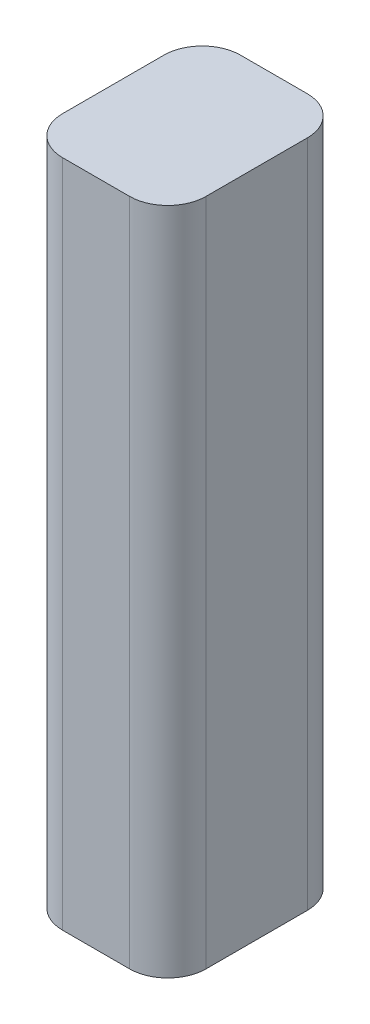
ISO-10303-21;
HEADER;
FILE_DESCRIPTION(('STEP AP214'),'2;1');
FILE_NAME('part.step','',(''),(''),'','','');
FILE_SCHEMA(('AUTOMOTIVE_DESIGN { 1 0 10303 214 1 1 1 1 }'));
ENDSEC;
DATA;
#1=APPLICATION_CONTEXT('core data for automotive mechanical design processes');
#2=APPLICATION_PROTOCOL_DEFINITION('international standard','automotive_design',2000,#1);
#3=PRODUCT_CONTEXT('',#1,'mechanical');
#4=PRODUCT('Part','Part','',(#3));
#5=PRODUCT_RELATED_PRODUCT_CATEGORY('part','',(#4));
#6=PRODUCT_DEFINITION_FORMATION('','',#4);
#7=PRODUCT_DEFINITION_CONTEXT('part definition',#1,'design');
#8=PRODUCT_DEFINITION('design','',#6,#7);
#9=PRODUCT_DEFINITION_SHAPE('','',#8);
#10=(LENGTH_UNIT() NAMED_UNIT(*) SI_UNIT(.MILLI.,.METRE.));
#11=(NAMED_UNIT(*) PLANE_ANGLE_UNIT() SI_UNIT($,.RADIAN.));
#12=(NAMED_UNIT(*) SI_UNIT($,.STERADIAN.) SOLID_ANGLE_UNIT());
#13=UNCERTAINTY_MEASURE_WITH_UNIT(LENGTH_MEASURE(1.E-05),#10,'distance_accuracy_value','');
#14=(GEOMETRIC_REPRESENTATION_CONTEXT(3) GLOBAL_UNCERTAINTY_ASSIGNED_CONTEXT((#13)) GLOBAL_UNIT_ASSIGNED_CONTEXT((#10,
#11,#12)) REPRESENTATION_CONTEXT('',''));
#15=CARTESIAN_POINT('',(0.,0.,0.));
#16=DIRECTION('',(0.,0.,1.));
#17=DIRECTION('',(1.,0.,0.));
#18=AXIS2_PLACEMENT_3D('',#15,#16,#17);
#19=CARTESIAN_POINT('',(-1.75,17.5,2.65));
#20=DIRECTION('',(0.,-1.,0.));
#21=DIRECTION('',(0.,0.,-1.));
#22=AXIS2_PLACEMENT_3D('',#19,#20,#21);
#23=CYLINDRICAL_SURFACE('',#22,2.);
#24=CARTESIAN_POINT('',(-1.75,-17.5,2.65));
#25=DIRECTION('',(0.,1.,0.));
#26=DIRECTION('',(0.,0.,-1.));
#27=AXIS2_PLACEMENT_3D('',#24,#25,#26);
#28=CIRCLE('',#27,2.);
#29=CARTESIAN_POINT('',(-3.75,-17.5,2.65));
#30=VERTEX_POINT('',#29);
#31=CARTESIAN_POINT('',(-1.75,-17.5,4.65));
#32=VERTEX_POINT('',#31);
#33=EDGE_CURVE('E146',#30,#32,#28,.T.);
#34=ORIENTED_EDGE('',*,*,#33,.T.);
#35=DIRECTION('',(0.,-1.,0.));
#36=VECTOR('',#35,1.);
#37=CARTESIAN_POINT('',(-1.75,17.5,4.65));
#38=LINE('',#37,#36);
#39=CARTESIAN_POINT('',(-1.75,17.5,4.65));
#40=VERTEX_POINT('',#39);
#41=EDGE_CURVE('E11',#40,#32,#38,.T.);
#42=ORIENTED_EDGE('',*,*,#41,.F.);
#43=CARTESIAN_POINT('',(-1.75,17.5,2.65));
#44=DIRECTION('',(0.,1.,0.));
#45=DIRECTION('',(0.,0.,-1.));
#46=AXIS2_PLACEMENT_3D('',#43,#44,#45);
#47=CIRCLE('',#46,2.);
#48=CARTESIAN_POINT('',(-3.75,17.5,2.65));
#49=VERTEX_POINT('',#48);
#50=EDGE_CURVE('E168',#49,#40,#47,.T.);
#51=ORIENTED_EDGE('',*,*,#50,.F.);
#52=DIRECTION('',(0.,-1.,0.));
#53=VECTOR('',#52,1.);
#54=CARTESIAN_POINT('',(-3.75,17.5,2.65));
#55=LINE('',#54,#53);
#56=EDGE_CURVE('E142',#49,#30,#55,.T.);
#57=ORIENTED_EDGE('',*,*,#56,.T.);
#58=EDGE_LOOP('',(#34,#42,#51,#57));
#59=FACE_BOUND('',#58,.T.);
#60=ADVANCED_FACE('F45',(#59),#23,.T.);
#61=CARTESIAN_POINT('',(1.75,17.5,4.65));
#62=DIRECTION('',(0.,0.,-1.));
#63=DIRECTION('',(-1.,0.,0.));
#64=AXIS2_PLACEMENT_3D('',#61,#62,#63);
#65=PLANE('',#64);
#66=DIRECTION('',(1.,0.,0.));
#67=VECTOR('',#66,1.);
#68=CARTESIAN_POINT('',(1.75,-17.5,4.65));
#69=LINE('',#68,#67);
#70=CARTESIAN_POINT('',(1.75,-17.5,4.65));
#71=VERTEX_POINT('',#70);
#72=EDGE_CURVE('E150',#32,#71,#69,.T.);
#73=ORIENTED_EDGE('',*,*,#72,.T.);
#74=DIRECTION('',(0.,-1.,0.));
#75=VECTOR('',#74,1.);
#76=CARTESIAN_POINT('',(1.75,17.5,4.65));
#77=LINE('',#76,#75);
#78=CARTESIAN_POINT('',(1.75,17.5,4.65));
#79=VERTEX_POINT('',#78);
#80=EDGE_CURVE('E54',#79,#71,#77,.T.);
#81=ORIENTED_EDGE('',*,*,#80,.F.);
#82=DIRECTION('',(1.,0.,0.));
#83=VECTOR('',#82,1.);
#84=CARTESIAN_POINT('',(1.75,17.5,4.65));
#85=LINE('',#84,#83);
#86=EDGE_CURVE('E105',#40,#79,#85,.T.);
#87=ORIENTED_EDGE('',*,*,#86,.F.);
#88=ORIENTED_EDGE('',*,*,#41,.T.);
#89=EDGE_LOOP('',(#73,#81,#87,#88));
#90=FACE_BOUND('',#89,.T.);
#91=ADVANCED_FACE('F214',(#90),#65,.F.);
#92=CARTESIAN_POINT('',(1.75,17.5,2.65));
#93=DIRECTION('',(0.,-1.,0.));
#94=DIRECTION('',(0.,0.,-1.));
#95=AXIS2_PLACEMENT_3D('',#92,#93,#94);
#96=CYLINDRICAL_SURFACE('',#95,2.);
#97=CARTESIAN_POINT('',(1.75,-17.5,2.65));
#98=DIRECTION('',(0.,1.,0.));
#99=DIRECTION('',(0.,0.,-1.));
#100=AXIS2_PLACEMENT_3D('',#97,#98,#99);
#101=CIRCLE('',#100,2.);
#102=CARTESIAN_POINT('',(3.75,-17.5,2.65));
#103=VERTEX_POINT('',#102);
#104=EDGE_CURVE('E153',#71,#103,#101,.T.);
#105=ORIENTED_EDGE('',*,*,#104,.T.);
#106=DIRECTION('',(0.,-1.,0.));
#107=VECTOR('',#106,1.);
#108=CARTESIAN_POINT('',(3.75,17.5,2.65));
#109=LINE('',#108,#107);
#110=CARTESIAN_POINT('',(3.75,17.5,2.65));
#111=VERTEX_POINT('',#110);
#112=EDGE_CURVE('E179',#111,#103,#109,.T.);
#113=ORIENTED_EDGE('',*,*,#112,.F.);
#114=CARTESIAN_POINT('',(1.75,17.5,2.65));
#115=DIRECTION('',(0.,1.,0.));
#116=DIRECTION('',(0.,0.,-1.));
#117=AXIS2_PLACEMENT_3D('',#114,#115,#116);
#118=CIRCLE('',#117,2.);
#119=EDGE_CURVE('E189',#79,#111,#118,.T.);
#120=ORIENTED_EDGE('',*,*,#119,.F.);
#121=ORIENTED_EDGE('',*,*,#80,.T.);
#122=EDGE_LOOP('',(#105,#113,#120,#121));
#123=FACE_BOUND('',#122,.T.);
#124=ADVANCED_FACE('F187',(#123),#96,.T.);
#125=CARTESIAN_POINT('',(3.75,17.5,-2.65));
#126=DIRECTION('',(-1.,0.,0.));
#127=DIRECTION('',(0.,0.,1.));
#128=AXIS2_PLACEMENT_3D('',#125,#126,#127);
#129=PLANE('',#128);
#130=DIRECTION('',(0.,0.,-1.));
#131=VECTOR('',#130,1.);
#132=CARTESIAN_POINT('',(3.75,-17.5,-2.65));
#133=LINE('',#132,#131);
#134=CARTESIAN_POINT('',(3.75,-17.5,-2.65));
#135=VERTEX_POINT('',#134);
#136=EDGE_CURVE('E156',#103,#135,#133,.T.);
#137=ORIENTED_EDGE('',*,*,#136,.T.);
#138=DIRECTION('',(0.,-1.,0.));
#139=VECTOR('',#138,1.);
#140=CARTESIAN_POINT('',(3.75,17.5,-2.65));
#141=LINE('',#140,#139);
#142=CARTESIAN_POINT('',(3.75,17.5,-2.65));
#143=VERTEX_POINT('',#142);
#144=EDGE_CURVE('E175',#143,#135,#141,.T.);
#145=ORIENTED_EDGE('',*,*,#144,.F.);
#146=DIRECTION('',(0.,0.,-1.));
#147=VECTOR('',#146,1.);
#148=CARTESIAN_POINT('',(3.75,17.5,-2.65));
#149=LINE('',#148,#147);
#150=EDGE_CURVE('E202',#111,#143,#149,.T.);
#151=ORIENTED_EDGE('',*,*,#150,.F.);
#152=ORIENTED_EDGE('',*,*,#112,.T.);
#153=EDGE_LOOP('',(#137,#145,#151,#152));
#154=FACE_BOUND('',#153,.T.);
#155=ADVANCED_FACE('F197',(#154),#129,.F.);
#156=CARTESIAN_POINT('',(1.75,17.5,-2.65));
#157=DIRECTION('',(0.,-1.,0.));
#158=DIRECTION('',(0.,0.,-1.));
#159=AXIS2_PLACEMENT_3D('',#156,#157,#158);
#160=CYLINDRICAL_SURFACE('',#159,2.);
#161=CARTESIAN_POINT('',(1.75,-17.5,-2.65));
#162=DIRECTION('',(0.,1.,0.));
#163=DIRECTION('',(0.,0.,-1.));
#164=AXIS2_PLACEMENT_3D('',#161,#162,#163);
#165=CIRCLE('',#164,2.);
#166=CARTESIAN_POINT('',(1.75,-17.5,-4.65));
#167=VERTEX_POINT('',#166);
#168=EDGE_CURVE('E159',#135,#167,#165,.T.);
#169=ORIENTED_EDGE('',*,*,#168,.T.);
#170=DIRECTION('',(0.,-1.,0.));
#171=VECTOR('',#170,1.);
#172=CARTESIAN_POINT('',(1.75,17.5,-4.65));
#173=LINE('',#172,#171);
#174=CARTESIAN_POINT('',(1.75,17.5,-4.65));
#175=VERTEX_POINT('',#174);
#176=EDGE_CURVE('E135',#175,#167,#173,.T.);
#177=ORIENTED_EDGE('',*,*,#176,.F.);
#178=CARTESIAN_POINT('',(1.75,17.5,-2.65));
#179=DIRECTION('',(0.,1.,0.));
#180=DIRECTION('',(0.,0.,-1.));
#181=AXIS2_PLACEMENT_3D('',#178,#179,#180);
#182=CIRCLE('',#181,2.);
#183=EDGE_CURVE('E124',#143,#175,#182,.T.);
#184=ORIENTED_EDGE('',*,*,#183,.F.);
#185=ORIENTED_EDGE('',*,*,#144,.T.);
#186=EDGE_LOOP('',(#169,#177,#184,#185));
#187=FACE_BOUND('',#186,.T.);
#188=ADVANCED_FACE('F200',(#187),#160,.T.);
#189=CARTESIAN_POINT('',(-1.75,17.5,-4.65));
#190=DIRECTION('',(0.,0.,1.));
#191=DIRECTION('',(1.,0.,0.));
#192=AXIS2_PLACEMENT_3D('',#189,#190,#191);
#193=PLANE('',#192);
#194=DIRECTION('',(-1.,0.,0.));
#195=VECTOR('',#194,1.);
#196=CARTESIAN_POINT('',(-1.75,-17.5,-4.65));
#197=LINE('',#196,#195);
#198=CARTESIAN_POINT('',(-1.75,-17.5,-4.65));
#199=VERTEX_POINT('',#198);
#200=EDGE_CURVE('E133',#167,#199,#197,.T.);
#201=ORIENTED_EDGE('',*,*,#200,.T.);
#202=DIRECTION('',(0.,-1.,0.));
#203=VECTOR('',#202,1.);
#204=CARTESIAN_POINT('',(-1.75,17.5,-4.65));
#205=LINE('',#204,#203);
#206=CARTESIAN_POINT('',(-1.75,17.5,-4.65));
#207=VERTEX_POINT('',#206);
#208=EDGE_CURVE('E130',#207,#199,#205,.T.);
#209=ORIENTED_EDGE('',*,*,#208,.F.);
#210=DIRECTION('',(-1.,0.,0.));
#211=VECTOR('',#210,1.);
#212=CARTESIAN_POINT('',(-1.75,17.5,-4.65));
#213=LINE('',#212,#211);
#214=EDGE_CURVE('E118',#175,#207,#213,.T.);
#215=ORIENTED_EDGE('',*,*,#214,.F.);
#216=ORIENTED_EDGE('',*,*,#176,.T.);
#217=EDGE_LOOP('',(#201,#209,#215,#216));
#218=FACE_BOUND('',#217,.T.);
#219=ADVANCED_FACE('F131',(#218),#193,.F.);
#220=CARTESIAN_POINT('',(-1.75,17.5,-2.65));
#221=DIRECTION('',(0.,-1.,0.));
#222=DIRECTION('',(0.,0.,-1.));
#223=AXIS2_PLACEMENT_3D('',#220,#221,#222);
#224=CYLINDRICAL_SURFACE('',#223,2.);
#225=CARTESIAN_POINT('',(-1.75,-17.5,-2.65));
#226=DIRECTION('',(0.,1.,0.));
#227=DIRECTION('',(0.,0.,-1.));
#228=AXIS2_PLACEMENT_3D('',#225,#226,#227);
#229=CIRCLE('',#228,2.);
#230=CARTESIAN_POINT('',(-3.75,-17.5,-2.65));
#231=VERTEX_POINT('',#230);
#232=EDGE_CURVE('E91',#199,#231,#229,.T.);
#233=ORIENTED_EDGE('',*,*,#232,.T.);
#234=DIRECTION('',(0.,-1.,0.));
#235=VECTOR('',#234,1.);
#236=CARTESIAN_POINT('',(-3.75,17.5,-2.65));
#237=LINE('',#236,#235);
#238=CARTESIAN_POINT('',(-3.75,17.5,-2.65));
#239=VERTEX_POINT('',#238);
#240=EDGE_CURVE('E136',#239,#231,#237,.T.);
#241=ORIENTED_EDGE('',*,*,#240,.F.);
#242=CARTESIAN_POINT('',(-1.75,17.5,-2.65));
#243=DIRECTION('',(0.,1.,0.));
#244=DIRECTION('',(0.,0.,-1.));
#245=AXIS2_PLACEMENT_3D('',#242,#243,#244);
#246=CIRCLE('',#245,2.);
#247=EDGE_CURVE('E122',#207,#239,#246,.T.);
#248=ORIENTED_EDGE('',*,*,#247,.F.);
#249=ORIENTED_EDGE('',*,*,#208,.T.);
#250=EDGE_LOOP('',(#233,#241,#248,#249));
#251=FACE_BOUND('',#250,.T.);
#252=ADVANCED_FACE('F138',(#251),#224,.T.);
#253=CARTESIAN_POINT('',(-3.75,17.5,2.65));
#254=DIRECTION('',(1.,0.,0.));
#255=DIRECTION('',(0.,0.,-1.));
#256=AXIS2_PLACEMENT_3D('',#253,#254,#255);
#257=PLANE('',#256);
#258=DIRECTION('',(0.,0.,1.));
#259=VECTOR('',#258,1.);
#260=CARTESIAN_POINT('',(-3.75,-17.5,2.65));
#261=LINE('',#260,#259);
#262=EDGE_CURVE('E97',#231,#30,#261,.T.);
#263=ORIENTED_EDGE('',*,*,#262,.T.);
#264=ORIENTED_EDGE('',*,*,#56,.F.);
#265=DIRECTION('',(0.,0.,1.));
#266=VECTOR('',#265,1.);
#267=CARTESIAN_POINT('',(-3.75,17.5,2.65));
#268=LINE('',#267,#266);
#269=EDGE_CURVE('E62',#239,#49,#268,.T.);
#270=ORIENTED_EDGE('',*,*,#269,.F.);
#271=ORIENTED_EDGE('',*,*,#240,.T.);
#272=EDGE_LOOP('',(#263,#264,#270,#271));
#273=FACE_BOUND('',#272,.T.);
#274=ADVANCED_FACE('F230',(#273),#257,.F.);
#275=CARTESIAN_POINT('',(-1.75,17.5,2.65));
#276=DIRECTION('',(0.,-1.,0.));
#277=DIRECTION('',(0.,0.,-1.));
#278=AXIS2_PLACEMENT_3D('',#275,#276,#277);
#279=PLANE('',#278);
#280=ORIENTED_EDGE('',*,*,#50,.T.);
#281=ORIENTED_EDGE('',*,*,#86,.T.);
#282=ORIENTED_EDGE('',*,*,#119,.T.);
#283=ORIENTED_EDGE('',*,*,#150,.T.);
#284=ORIENTED_EDGE('',*,*,#183,.T.);
#285=ORIENTED_EDGE('',*,*,#214,.T.);
#286=ORIENTED_EDGE('',*,*,#247,.T.);
#287=ORIENTED_EDGE('',*,*,#269,.T.);
#288=EDGE_LOOP('',(#280,#281,#282,#283,#284,#285,#286,#287));
#289=FACE_BOUND('',#288,.T.);
#290=ADVANCED_FACE('F120',(#289),#279,.F.);
#291=CARTESIAN_POINT('',(-1.75,-17.5,2.65));
#292=DIRECTION('',(0.,-1.,0.));
#293=DIRECTION('',(0.,0.,-1.));
#294=AXIS2_PLACEMENT_3D('',#291,#292,#293);
#295=PLANE('',#294);
#296=ORIENTED_EDGE('',*,*,#33,.F.);
#297=ORIENTED_EDGE('',*,*,#262,.F.);
#298=ORIENTED_EDGE('',*,*,#232,.F.);
#299=ORIENTED_EDGE('',*,*,#200,.F.);
#300=ORIENTED_EDGE('',*,*,#168,.F.);
#301=ORIENTED_EDGE('',*,*,#136,.F.);
#302=ORIENTED_EDGE('',*,*,#104,.F.);
#303=ORIENTED_EDGE('',*,*,#72,.F.);
#304=EDGE_LOOP('',(#296,#297,#298,#299,#300,#301,#302,#303));
#305=FACE_BOUND('',#304,.T.);
#306=ADVANCED_FACE('F193',(#305),#295,.T.);
#307=CLOSED_SHELL('',(#60,#91,#124,#155,#188,#219,#252,#274,#290,#306));
#308=MANIFOLD_SOLID_BREP('B2',#307);
#309=ADVANCED_BREP_SHAPE_REPRESENTATION('',(#18,#308),#14);
#310=SHAPE_DEFINITION_REPRESENTATION(#9,#309);
ENDSEC;
END-ISO-10303-21;
